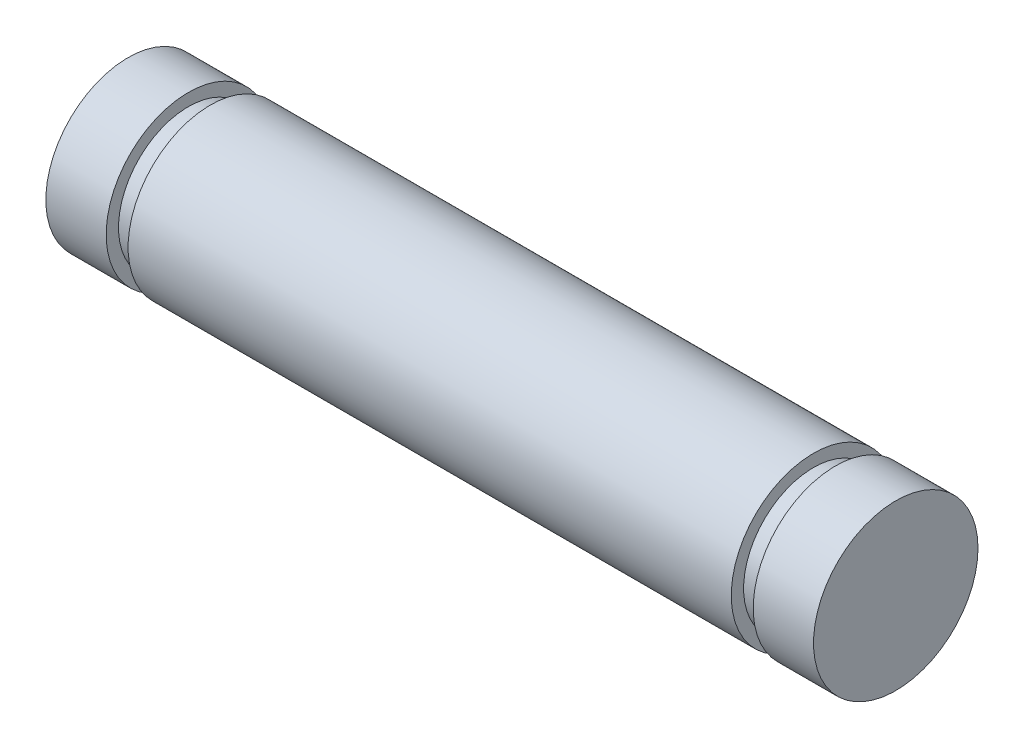
ISO-10303-21;
HEADER;
FILE_DESCRIPTION(('STEP AP214'),'2;1');
FILE_NAME('part.step','',(''),(''),'','','');
FILE_SCHEMA(('AUTOMOTIVE_DESIGN { 1 0 10303 214 1 1 1 1 }'));
ENDSEC;
DATA;
#1=APPLICATION_CONTEXT('core data for automotive mechanical design processes');
#2=APPLICATION_PROTOCOL_DEFINITION('international standard','automotive_design',2000,#1);
#3=PRODUCT_CONTEXT('',#1,'mechanical');
#4=PRODUCT('Part','Part','',(#3));
#5=PRODUCT_RELATED_PRODUCT_CATEGORY('part','',(#4));
#6=PRODUCT_DEFINITION_FORMATION('','',#4);
#7=PRODUCT_DEFINITION_CONTEXT('part definition',#1,'design');
#8=PRODUCT_DEFINITION('design','',#6,#7);
#9=PRODUCT_DEFINITION_SHAPE('','',#8);
#10=(LENGTH_UNIT() NAMED_UNIT(*) SI_UNIT(.MILLI.,.METRE.));
#11=(NAMED_UNIT(*) PLANE_ANGLE_UNIT() SI_UNIT($,.RADIAN.));
#12=(NAMED_UNIT(*) SI_UNIT($,.STERADIAN.) SOLID_ANGLE_UNIT());
#13=UNCERTAINTY_MEASURE_WITH_UNIT(LENGTH_MEASURE(1.E-05),#10,'distance_accuracy_value','');
#14=(GEOMETRIC_REPRESENTATION_CONTEXT(3) GLOBAL_UNCERTAINTY_ASSIGNED_CONTEXT((#13)) GLOBAL_UNIT_ASSIGNED_CONTEXT((#10,
#11,#12)) REPRESENTATION_CONTEXT('',''));
#15=CARTESIAN_POINT('',(0.,0.,0.));
#16=DIRECTION('',(0.,0.,1.));
#17=DIRECTION('',(1.,0.,0.));
#18=AXIS2_PLACEMENT_3D('',#15,#16,#17);
#19=CARTESIAN_POINT('',(14.,0.,3.00000000000002));
#20=DIRECTION('',(-1.,0.,0.));
#21=DIRECTION('',(0.,0.,1.));
#22=AXIS2_PLACEMENT_3D('',#19,#20,#21);
#23=PLANE('',#22);
#24=CARTESIAN_POINT('',(14.,0.,0.));
#25=DIRECTION('',(1.,0.,0.));
#26=DIRECTION('',(0.,0.,-1.));
#27=AXIS2_PLACEMENT_3D('',#24,#25,#26);
#28=CIRCLE('',#27,3.00000000000002);
#29=CARTESIAN_POINT('',(14.,0.,-3.00000000000002));
#30=VERTEX_POINT('',#29);
#31=EDGE_CURVE('E75',#30,#30,#28,.T.);
#32=ORIENTED_EDGE('',*,*,#31,.T.);
#33=EDGE_LOOP('',(#32));
#34=FACE_BOUND('',#33,.T.);
#35=ADVANCED_FACE('F41',(#34),#23,.F.);
#36=CARTESIAN_POINT('',(-14.,0.,3.00000000000002));
#37=DIRECTION('',(1.,0.,0.));
#38=DIRECTION('',(0.,0.,-1.));
#39=AXIS2_PLACEMENT_3D('',#36,#37,#38);
#40=PLANE('',#39);
#41=CARTESIAN_POINT('',(-14.,0.,0.));
#42=DIRECTION('',(1.,0.,0.));
#43=DIRECTION('',(0.,0.,-1.));
#44=AXIS2_PLACEMENT_3D('',#41,#42,#43);
#45=CIRCLE('',#44,3.00000000000002);
#46=CARTESIAN_POINT('',(-14.,0.,-3.00000000000002));
#47=VERTEX_POINT('',#46);
#48=EDGE_CURVE('E10',#47,#47,#45,.T.);
#49=ORIENTED_EDGE('',*,*,#48,.F.);
#50=EDGE_LOOP('',(#49));
#51=FACE_BOUND('',#50,.T.);
#52=ADVANCED_FACE('F129',(#51),#40,.F.);
#53=CARTESIAN_POINT('',(14.,0.,0.));
#54=DIRECTION('',(1.,0.,0.));
#55=DIRECTION('',(0.,0.,-1.));
#56=AXIS2_PLACEMENT_3D('',#53,#54,#55);
#57=CYLINDRICAL_SURFACE('',#56,3.00000000000001);
#58=CARTESIAN_POINT('',(-11.8,0.,0.));
#59=DIRECTION('',(1.,0.,0.));
#60=DIRECTION('',(0.,0.,-1.));
#61=AXIS2_PLACEMENT_3D('',#58,#59,#60);
#62=CIRCLE('',#61,3.);
#63=CARTESIAN_POINT('',(-11.8,0.,-3.));
#64=VERTEX_POINT('',#63);
#65=EDGE_CURVE('E47',#64,#64,#62,.T.);
#66=ORIENTED_EDGE('',*,*,#65,.F.);
#67=EDGE_LOOP('',(#66));
#68=FACE_BOUND('',#67,.T.);
#69=ORIENTED_EDGE('',*,*,#48,.T.);
#70=EDGE_LOOP('',(#69));
#71=FACE_BOUND('',#70,.T.);
#72=ADVANCED_FACE('F124',(#68,#71),#57,.T.);
#73=CARTESIAN_POINT('',(-11.8,0.,2.55));
#74=DIRECTION('',(-1.,0.,0.));
#75=DIRECTION('',(0.,0.,1.));
#76=AXIS2_PLACEMENT_3D('',#73,#74,#75);
#77=PLANE('',#76);
#78=CARTESIAN_POINT('',(-11.8,0.,0.));
#79=DIRECTION('',(1.,0.,0.));
#80=DIRECTION('',(0.,0.,-1.));
#81=AXIS2_PLACEMENT_3D('',#78,#79,#80);
#82=CIRCLE('',#81,2.55);
#83=CARTESIAN_POINT('',(-11.8,0.,-2.55));
#84=VERTEX_POINT('',#83);
#85=EDGE_CURVE('E51',#84,#84,#82,.T.);
#86=ORIENTED_EDGE('',*,*,#85,.F.);
#87=EDGE_LOOP('',(#86));
#88=FACE_BOUND('',#87,.T.);
#89=ORIENTED_EDGE('',*,*,#65,.T.);
#90=EDGE_LOOP('',(#89));
#91=FACE_BOUND('',#90,.T.);
#92=ADVANCED_FACE('F119',(#88,#91),#77,.F.);
#93=CARTESIAN_POINT('',(14.,0.,0.));
#94=DIRECTION('',(1.,0.,0.));
#95=DIRECTION('',(0.,0.,-1.));
#96=AXIS2_PLACEMENT_3D('',#93,#94,#95);
#97=CYLINDRICAL_SURFACE('',#96,2.55);
#98=CARTESIAN_POINT('',(-11.,0.,0.));
#99=DIRECTION('',(1.,0.,0.));
#100=DIRECTION('',(0.,0.,-1.));
#101=AXIS2_PLACEMENT_3D('',#98,#99,#100);
#102=CIRCLE('',#101,2.55);
#103=CARTESIAN_POINT('',(-11.,0.,-2.55));
#104=VERTEX_POINT('',#103);
#105=EDGE_CURVE('E55',#104,#104,#102,.T.);
#106=ORIENTED_EDGE('',*,*,#105,.F.);
#107=EDGE_LOOP('',(#106));
#108=FACE_BOUND('',#107,.T.);
#109=ORIENTED_EDGE('',*,*,#85,.T.);
#110=EDGE_LOOP('',(#109));
#111=FACE_BOUND('',#110,.T.);
#112=ADVANCED_FACE('F113',(#108,#111),#97,.T.);
#113=CARTESIAN_POINT('',(-11.,0.,3.));
#114=DIRECTION('',(1.,0.,0.));
#115=DIRECTION('',(0.,0.,-1.));
#116=AXIS2_PLACEMENT_3D('',#113,#114,#115);
#117=PLANE('',#116);
#118=CARTESIAN_POINT('',(-11.,0.,0.));
#119=DIRECTION('',(1.,0.,0.));
#120=DIRECTION('',(0.,0.,-1.));
#121=AXIS2_PLACEMENT_3D('',#118,#119,#120);
#122=CIRCLE('',#121,3.);
#123=CARTESIAN_POINT('',(-11.,0.,-3.));
#124=VERTEX_POINT('',#123);
#125=EDGE_CURVE('E60',#124,#124,#122,.T.);
#126=ORIENTED_EDGE('',*,*,#125,.F.);
#127=EDGE_LOOP('',(#126));
#128=FACE_BOUND('',#127,.T.);
#129=ORIENTED_EDGE('',*,*,#105,.T.);
#130=EDGE_LOOP('',(#129));
#131=FACE_BOUND('',#130,.T.);
#132=ADVANCED_FACE('F107',(#128,#131),#117,.F.);
#133=CARTESIAN_POINT('',(14.,0.,0.));
#134=DIRECTION('',(1.,0.,0.));
#135=DIRECTION('',(0.,0.,-1.));
#136=AXIS2_PLACEMENT_3D('',#133,#134,#135);
#137=CYLINDRICAL_SURFACE('',#136,3.);
#138=CARTESIAN_POINT('',(11.,0.,0.));
#139=DIRECTION('',(1.,0.,0.));
#140=DIRECTION('',(0.,0.,-1.));
#141=AXIS2_PLACEMENT_3D('',#138,#139,#140);
#142=CIRCLE('',#141,3.);
#143=CARTESIAN_POINT('',(11.,0.,-3.));
#144=VERTEX_POINT('',#143);
#145=EDGE_CURVE('E63',#144,#144,#142,.T.);
#146=ORIENTED_EDGE('',*,*,#145,.F.);
#147=EDGE_LOOP('',(#146));
#148=FACE_BOUND('',#147,.T.);
#149=ORIENTED_EDGE('',*,*,#125,.T.);
#150=EDGE_LOOP('',(#149));
#151=FACE_BOUND('',#150,.T.);
#152=ADVANCED_FACE('F101',(#148,#151),#137,.T.);
#153=CARTESIAN_POINT('',(11.,0.,3.));
#154=DIRECTION('',(-1.,0.,0.));
#155=DIRECTION('',(0.,0.,1.));
#156=AXIS2_PLACEMENT_3D('',#153,#154,#155);
#157=PLANE('',#156);
#158=CARTESIAN_POINT('',(11.,0.,0.));
#159=DIRECTION('',(1.,0.,0.));
#160=DIRECTION('',(0.,0.,-1.));
#161=AXIS2_PLACEMENT_3D('',#158,#159,#160);
#162=CIRCLE('',#161,2.55);
#163=CARTESIAN_POINT('',(11.,0.,-2.55));
#164=VERTEX_POINT('',#163);
#165=EDGE_CURVE('E66',#164,#164,#162,.T.);
#166=ORIENTED_EDGE('',*,*,#165,.F.);
#167=EDGE_LOOP('',(#166));
#168=FACE_BOUND('',#167,.T.);
#169=ORIENTED_EDGE('',*,*,#145,.T.);
#170=EDGE_LOOP('',(#169));
#171=FACE_BOUND('',#170,.T.);
#172=ADVANCED_FACE('F95',(#168,#171),#157,.F.);
#173=CARTESIAN_POINT('',(14.,0.,0.));
#174=DIRECTION('',(1.,0.,0.));
#175=DIRECTION('',(0.,0.,-1.));
#176=AXIS2_PLACEMENT_3D('',#173,#174,#175);
#177=CYLINDRICAL_SURFACE('',#176,2.55);
#178=CARTESIAN_POINT('',(11.8,0.,0.));
#179=DIRECTION('',(1.,0.,0.));
#180=DIRECTION('',(0.,0.,-1.));
#181=AXIS2_PLACEMENT_3D('',#178,#179,#180);
#182=CIRCLE('',#181,2.55);
#183=CARTESIAN_POINT('',(11.8,0.,-2.55));
#184=VERTEX_POINT('',#183);
#185=EDGE_CURVE('E69',#184,#184,#182,.T.);
#186=ORIENTED_EDGE('',*,*,#185,.F.);
#187=EDGE_LOOP('',(#186));
#188=FACE_BOUND('',#187,.T.);
#189=ORIENTED_EDGE('',*,*,#165,.T.);
#190=EDGE_LOOP('',(#189));
#191=FACE_BOUND('',#190,.T.);
#192=ADVANCED_FACE('F89',(#188,#191),#177,.T.);
#193=CARTESIAN_POINT('',(11.8,0.,2.55));
#194=DIRECTION('',(1.,0.,0.));
#195=DIRECTION('',(0.,0.,-1.));
#196=AXIS2_PLACEMENT_3D('',#193,#194,#195);
#197=PLANE('',#196);
#198=CARTESIAN_POINT('',(11.8,0.,0.));
#199=DIRECTION('',(1.,0.,0.));
#200=DIRECTION('',(0.,0.,-1.));
#201=AXIS2_PLACEMENT_3D('',#198,#199,#200);
#202=CIRCLE('',#201,3.);
#203=CARTESIAN_POINT('',(11.8,0.,-3.));
#204=VERTEX_POINT('',#203);
#205=EDGE_CURVE('E72',#204,#204,#202,.T.);
#206=ORIENTED_EDGE('',*,*,#205,.F.);
#207=EDGE_LOOP('',(#206));
#208=FACE_BOUND('',#207,.T.);
#209=ORIENTED_EDGE('',*,*,#185,.T.);
#210=EDGE_LOOP('',(#209));
#211=FACE_BOUND('',#210,.T.);
#212=ADVANCED_FACE('F83',(#208,#211),#197,.F.);
#213=CARTESIAN_POINT('',(14.,0.,0.));
#214=DIRECTION('',(1.,0.,0.));
#215=DIRECTION('',(0.,0.,-1.));
#216=AXIS2_PLACEMENT_3D('',#213,#214,#215);
#217=CYLINDRICAL_SURFACE('',#216,3.00000000000001);
#218=ORIENTED_EDGE('',*,*,#31,.F.);
#219=EDGE_LOOP('',(#218));
#220=FACE_BOUND('',#219,.T.);
#221=ORIENTED_EDGE('',*,*,#205,.T.);
#222=EDGE_LOOP('',(#221));
#223=FACE_BOUND('',#222,.T.);
#224=ADVANCED_FACE('F80',(#220,#223),#217,.T.);
#225=CLOSED_SHELL('',(#35,#52,#72,#92,#112,#132,#152,#172,#192,#212,#224));
#226=MANIFOLD_SOLID_BREP('B2',#225);
#227=ADVANCED_BREP_SHAPE_REPRESENTATION('',(#18,#226),#14);
#228=SHAPE_DEFINITION_REPRESENTATION(#9,#227);
ENDSEC;
END-ISO-10303-21;
